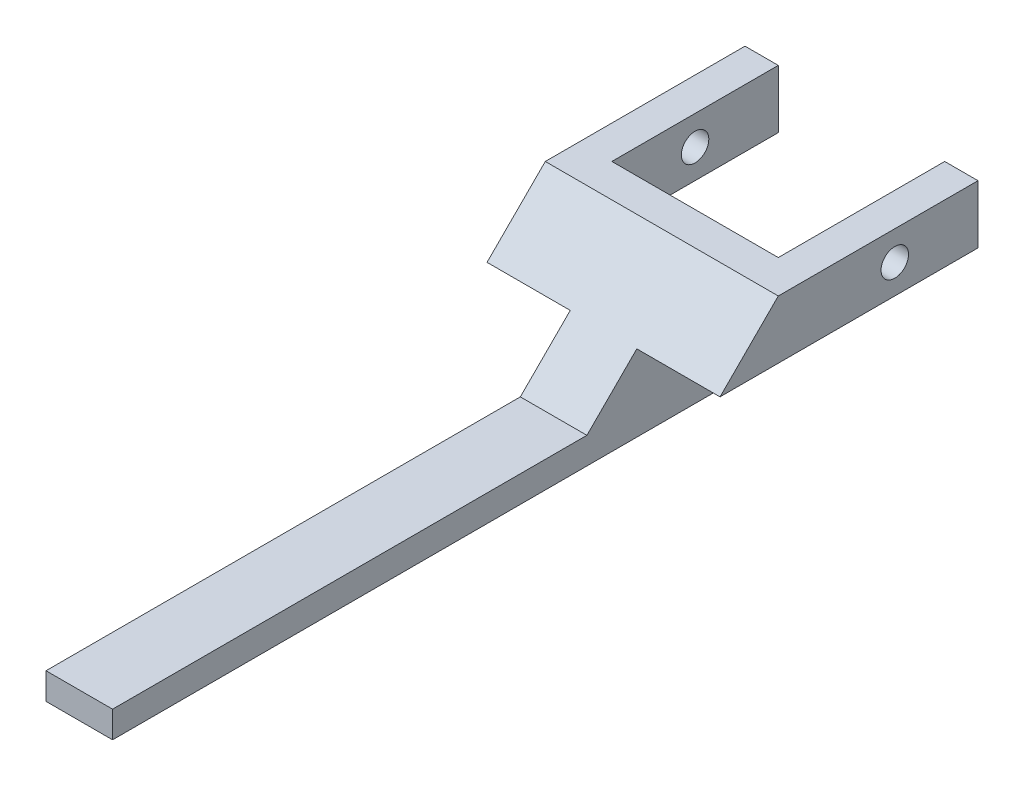
ISO-10303-21;
HEADER;
FILE_DESCRIPTION(('STEP AP214'),'2;1');
FILE_NAME('part.step','',(''),(''),'','','');
FILE_SCHEMA(('AUTOMOTIVE_DESIGN { 1 0 10303 214 1 1 1 1 }'));
ENDSEC;
DATA;
#1=APPLICATION_CONTEXT('core data for automotive mechanical design processes');
#2=APPLICATION_PROTOCOL_DEFINITION('international standard','automotive_design',2000,#1);
#3=PRODUCT_CONTEXT('',#1,'mechanical');
#4=PRODUCT('Part','Part','',(#3));
#5=PRODUCT_RELATED_PRODUCT_CATEGORY('part','',(#4));
#6=PRODUCT_DEFINITION_FORMATION('','',#4);
#7=PRODUCT_DEFINITION_CONTEXT('part definition',#1,'design');
#8=PRODUCT_DEFINITION('design','',#6,#7);
#9=PRODUCT_DEFINITION_SHAPE('','',#8);
#10=(LENGTH_UNIT() NAMED_UNIT(*) SI_UNIT(.MILLI.,.METRE.));
#11=(NAMED_UNIT(*) PLANE_ANGLE_UNIT() SI_UNIT($,.RADIAN.));
#12=(NAMED_UNIT(*) SI_UNIT($,.STERADIAN.) SOLID_ANGLE_UNIT());
#13=UNCERTAINTY_MEASURE_WITH_UNIT(LENGTH_MEASURE(1.E-05),#10,'distance_accuracy_value','');
#14=(GEOMETRIC_REPRESENTATION_CONTEXT(3) GLOBAL_UNCERTAINTY_ASSIGNED_CONTEXT((#13)) GLOBAL_UNIT_ASSIGNED_CONTEXT((#10,
#11,#12)) REPRESENTATION_CONTEXT('',''));
#15=CARTESIAN_POINT('',(0.,0.,0.));
#16=DIRECTION('',(0.,0.,1.));
#17=DIRECTION('',(1.,0.,0.));
#18=AXIS2_PLACEMENT_3D('',#15,#16,#17);
#19=CARTESIAN_POINT('',(0.,0.,24.));
#20=DIRECTION('',(0.,-1.,0.));
#21=DIRECTION('',(1.,0.,0.));
#22=AXIS2_PLACEMENT_3D('',#19,#20,#21);
#23=PLANE('',#22);
#24=DIRECTION('',(1.,0.,0.));
#25=VECTOR('',#24,1.);
#26=CARTESIAN_POINT('',(0.,0.,20.));
#27=LINE('',#26,#25);
#28=CARTESIAN_POINT('',(0.,0.,20.));
#29=VERTEX_POINT('',#28);
#30=CARTESIAN_POINT('',(6.,0.,20.));
#31=VERTEX_POINT('',#30);
#32=EDGE_CURVE('E212',#29,#31,#27,.T.);
#33=ORIENTED_EDGE('',*,*,#32,.T.);
#34=DIRECTION('',(0.,0.,1.));
#35=VECTOR('',#34,1.);
#36=CARTESIAN_POINT('',(6.,0.,8.5487447290817));
#37=LINE('',#36,#35);
#38=CARTESIAN_POINT('',(6.,0.,31.));
#39=VERTEX_POINT('',#38);
#40=EDGE_CURVE('E145',#31,#39,#37,.T.);
#41=ORIENTED_EDGE('',*,*,#40,.T.);
#42=DIRECTION('',(-1.,0.,0.));
#43=VECTOR('',#42,1.);
#44=CARTESIAN_POINT('',(6.,0.,31.));
#45=LINE('',#44,#43);
#46=CARTESIAN_POINT('',(-4.,0.,31.));
#47=VERTEX_POINT('',#46);
#48=EDGE_CURVE('E253',#39,#47,#45,.T.);
#49=ORIENTED_EDGE('',*,*,#48,.T.);
#50=DIRECTION('',(0.,0.,-1.));
#51=VECTOR('',#50,1.);
#52=CARTESIAN_POINT('',(-4.,0.,24.));
#53=LINE('',#52,#51);
#54=CARTESIAN_POINT('',(-4.,0.,0.));
#55=VERTEX_POINT('',#54);
#56=EDGE_CURVE('E241',#47,#55,#53,.T.);
#57=ORIENTED_EDGE('',*,*,#56,.T.);
#58=DIRECTION('',(-1.,0.,0.));
#59=VECTOR('',#58,1.);
#60=CARTESIAN_POINT('',(0.,0.,0.));
#61=LINE('',#60,#59);
#62=CARTESIAN_POINT('',(0.,0.,0.));
#63=VERTEX_POINT('',#62);
#64=EDGE_CURVE('E233',#63,#55,#61,.T.);
#65=ORIENTED_EDGE('',*,*,#64,.F.);
#66=DIRECTION('',(0.,0.,-1.));
#67=VECTOR('',#66,1.);
#68=CARTESIAN_POINT('',(0.,0.,24.));
#69=LINE('',#68,#67);
#70=EDGE_CURVE('E239',#29,#63,#69,.T.);
#71=ORIENTED_EDGE('',*,*,#70,.F.);
#72=EDGE_LOOP('',(#33,#41,#49,#57,#65,#71));
#73=FACE_BOUND('',#72,.T.);
#74=ADVANCED_FACE('F37',(#73),#23,.T.);
#75=CARTESIAN_POINT('',(0.,0.,24.));
#76=DIRECTION('',(-1.,0.,0.));
#77=DIRECTION('',(0.,-1.,0.));
#78=AXIS2_PLACEMENT_3D('',#75,#76,#77);
#79=PLANE('',#78);
#80=CARTESIAN_POINT('',(0.,3.5,10.));
#81=DIRECTION('',(-1.,0.,0.));
#82=DIRECTION('',(0.,-1.,0.));
#83=AXIS2_PLACEMENT_3D('',#80,#81,#82);
#84=CIRCLE('',#83,1.65);
#85=CARTESIAN_POINT('',(0.,1.85,10.));
#86=VERTEX_POINT('',#85);
#87=EDGE_CURVE('E175',#86,#86,#84,.T.);
#88=ORIENTED_EDGE('',*,*,#87,.T.);
#89=EDGE_LOOP('',(#88));
#90=FACE_BOUND('',#89,.T.);
#91=DIRECTION('',(0.,1.,0.));
#92=VECTOR('',#91,1.);
#93=CARTESIAN_POINT('',(0.,0.,20.));
#94=LINE('',#93,#92);
#95=CARTESIAN_POINT('',(0.,7.,20.));
#96=VERTEX_POINT('',#95);
#97=EDGE_CURVE('E219',#29,#96,#94,.T.);
#98=ORIENTED_EDGE('',*,*,#97,.F.);
#99=ORIENTED_EDGE('',*,*,#70,.T.);
#100=DIRECTION('',(0.,1.,0.));
#101=VECTOR('',#100,1.);
#102=CARTESIAN_POINT('',(0.,0.,0.));
#103=LINE('',#102,#101);
#104=CARTESIAN_POINT('',(0.,7.,0.));
#105=VERTEX_POINT('',#104);
#106=EDGE_CURVE('E227',#63,#105,#103,.T.);
#107=ORIENTED_EDGE('',*,*,#106,.T.);
#108=DIRECTION('',(0.,0.,-1.));
#109=VECTOR('',#108,1.);
#110=CARTESIAN_POINT('',(0.,7.,24.));
#111=LINE('',#110,#109);
#112=EDGE_CURVE('E226',#96,#105,#111,.T.);
#113=ORIENTED_EDGE('',*,*,#112,.F.);
#114=EDGE_LOOP('',(#98,#99,#107,#113));
#115=FACE_BOUND('',#114,.T.);
#116=ADVANCED_FACE('F281',(#90,#115),#79,.F.);
#117=CARTESIAN_POINT('',(0.,7.,24.));
#118=DIRECTION('',(0.,-1.,0.));
#119=DIRECTION('',(1.,0.,0.));
#120=AXIS2_PLACEMENT_3D('',#117,#118,#119);
#121=PLANE('',#120);
#122=DIRECTION('',(-1.,0.,0.));
#123=VECTOR('',#122,1.);
#124=CARTESIAN_POINT('',(0.,7.,0.));
#125=LINE('',#124,#123);
#126=CARTESIAN_POINT('',(-4.,7.,0.));
#127=VERTEX_POINT('',#126);
#128=EDGE_CURVE('E222',#105,#127,#125,.T.);
#129=ORIENTED_EDGE('',*,*,#128,.T.);
#130=DIRECTION('',(0.,0.,-1.));
#131=VECTOR('',#130,1.);
#132=CARTESIAN_POINT('',(-4.,7.,24.));
#133=LINE('',#132,#131);
#134=CARTESIAN_POINT('',(-4.,7.,24.));
#135=VERTEX_POINT('',#134);
#136=EDGE_CURVE('E243',#135,#127,#133,.T.);
#137=ORIENTED_EDGE('',*,*,#136,.F.);
#138=DIRECTION('',(-1.,0.,0.));
#139=VECTOR('',#138,1.);
#140=CARTESIAN_POINT('',(0.,7.,24.));
#141=LINE('',#140,#139);
#142=CARTESIAN_POINT('',(24.,7.,24.));
#143=VERTEX_POINT('',#142);
#144=EDGE_CURVE('E223',#143,#135,#141,.T.);
#145=ORIENTED_EDGE('',*,*,#144,.F.);
#146=DIRECTION('',(0.,0.,-1.));
#147=VECTOR('',#146,1.);
#148=CARTESIAN_POINT('',(24.,7.,24.));
#149=LINE('',#148,#147);
#150=CARTESIAN_POINT('',(24.,7.,0.));
#151=VERTEX_POINT('',#150);
#152=EDGE_CURVE('E209',#143,#151,#149,.T.);
#153=ORIENTED_EDGE('',*,*,#152,.T.);
#154=DIRECTION('',(1.,0.,0.));
#155=VECTOR('',#154,1.);
#156=CARTESIAN_POINT('',(0.,7.,0.));
#157=LINE('',#156,#155);
#158=CARTESIAN_POINT('',(20.,7.,0.));
#159=VERTEX_POINT('',#158);
#160=EDGE_CURVE('E196',#159,#151,#157,.T.);
#161=ORIENTED_EDGE('',*,*,#160,.F.);
#162=DIRECTION('',(0.,0.,-1.));
#163=VECTOR('',#162,1.);
#164=CARTESIAN_POINT('',(20.,7.,24.));
#165=LINE('',#164,#163);
#166=CARTESIAN_POINT('',(20.,7.,20.));
#167=VERTEX_POINT('',#166);
#168=EDGE_CURVE('E207',#167,#159,#165,.T.);
#169=ORIENTED_EDGE('',*,*,#168,.F.);
#170=DIRECTION('',(1.,0.,0.));
#171=VECTOR('',#170,1.);
#172=CARTESIAN_POINT('',(0.,7.,20.));
#173=LINE('',#172,#171);
#174=EDGE_CURVE('E217',#96,#167,#173,.T.);
#175=ORIENTED_EDGE('',*,*,#174,.F.);
#176=ORIENTED_EDGE('',*,*,#112,.T.);
#177=EDGE_LOOP('',(#129,#137,#145,#153,#161,#169,#175,#176));
#178=FACE_BOUND('',#177,.T.);
#179=ADVANCED_FACE('F286',(#178),#121,.F.);
#180=CARTESIAN_POINT('',(-4.,0.,24.));
#181=DIRECTION('',(1.,0.,0.));
#182=DIRECTION('',(0.,1.,0.));
#183=AXIS2_PLACEMENT_3D('',#180,#181,#182);
#184=PLANE('',#183);
#185=CARTESIAN_POINT('',(-4.,3.5,10.));
#186=DIRECTION('',(1.,0.,0.));
#187=DIRECTION('',(0.,1.,0.));
#188=AXIS2_PLACEMENT_3D('',#185,#186,#187);
#189=CIRCLE('',#188,1.65);
#190=CARTESIAN_POINT('',(-4.,5.15,10.));
#191=VERTEX_POINT('',#190);
#192=EDGE_CURVE('E171',#191,#191,#189,.F.);
#193=ORIENTED_EDGE('',*,*,#192,.F.);
#194=EDGE_LOOP('',(#193));
#195=FACE_BOUND('',#194,.T.);
#196=DIRECTION('',(0.,-1.,0.));
#197=VECTOR('',#196,1.);
#198=CARTESIAN_POINT('',(-4.,0.,0.));
#199=LINE('',#198,#197);
#200=EDGE_CURVE('E230',#127,#55,#199,.T.);
#201=ORIENTED_EDGE('',*,*,#200,.T.);
#202=ORIENTED_EDGE('',*,*,#56,.F.);
#203=DIRECTION('',(0.,0.707106781186544,-0.707106781186551));
#204=VECTOR('',#203,1.);
#205=CARTESIAN_POINT('',(-4.,3.50000000000001,27.5));
#206=LINE('',#205,#204);
#207=EDGE_CURVE('E256',#47,#135,#206,.T.);
#208=ORIENTED_EDGE('',*,*,#207,.T.);
#209=ORIENTED_EDGE('',*,*,#136,.T.);
#210=EDGE_LOOP('',(#201,#202,#208,#209));
#211=FACE_BOUND('',#210,.T.);
#212=ADVANCED_FACE('F301',(#195,#211),#184,.F.);
#213=DIRECTION('',(0.,0.,1.));
#214=VECTOR('',#213,1.);
#215=CARTESIAN_POINT('',(14.,0.,8.5487447290817));
#216=LINE('',#215,#214);
#217=CARTESIAN_POINT('',(14.,0.,20.));
#218=VERTEX_POINT('',#217);
#219=CARTESIAN_POINT('',(14.,0.,31.));
#220=VERTEX_POINT('',#219);
#221=EDGE_CURVE('E52',#218,#220,#216,.T.);
#222=ORIENTED_EDGE('',*,*,#221,.F.);
#223=CARTESIAN_POINT('',(20.,0.,20.));
#224=VERTEX_POINT('',#223);
#225=EDGE_CURVE('E211',#218,#224,#27,.T.);
#226=ORIENTED_EDGE('',*,*,#225,.T.);
#227=DIRECTION('',(0.,0.,-1.));
#228=VECTOR('',#227,1.);
#229=CARTESIAN_POINT('',(20.,0.,24.));
#230=LINE('',#229,#228);
#231=CARTESIAN_POINT('',(20.,0.,0.));
#232=VERTEX_POINT('',#231);
#233=EDGE_CURVE('E205',#224,#232,#230,.T.);
#234=ORIENTED_EDGE('',*,*,#233,.T.);
#235=DIRECTION('',(1.,0.,0.));
#236=VECTOR('',#235,1.);
#237=CARTESIAN_POINT('',(0.,0.,0.));
#238=LINE('',#237,#236);
#239=CARTESIAN_POINT('',(24.,0.,0.));
#240=VERTEX_POINT('',#239);
#241=EDGE_CURVE('E202',#232,#240,#238,.T.);
#242=ORIENTED_EDGE('',*,*,#241,.T.);
#243=DIRECTION('',(0.,0.,-1.));
#244=VECTOR('',#243,1.);
#245=CARTESIAN_POINT('',(24.,0.,24.));
#246=LINE('',#245,#244);
#247=CARTESIAN_POINT('',(24.,0.,31.));
#248=VERTEX_POINT('',#247);
#249=EDGE_CURVE('E59',#248,#240,#246,.T.);
#250=ORIENTED_EDGE('',*,*,#249,.F.);
#251=DIRECTION('',(-1.,0.,0.));
#252=VECTOR('',#251,1.);
#253=CARTESIAN_POINT('',(6.,0.,31.));
#254=LINE('',#253,#252);
#255=EDGE_CURVE('E46',#248,#220,#254,.T.);
#256=ORIENTED_EDGE('',*,*,#255,.T.);
#257=EDGE_LOOP('',(#222,#226,#234,#242,#250,#256));
#258=FACE_BOUND('',#257,.T.);
#259=ADVANCED_FACE('F261',(#258),#23,.T.);
#260=CARTESIAN_POINT('',(0.,0.,0.));
#261=DIRECTION('',(0.,0.,1.));
#262=DIRECTION('',(1.,0.,0.));
#263=AXIS2_PLACEMENT_3D('',#260,#261,#262);
#264=PLANE('',#263);
#265=ORIENTED_EDGE('',*,*,#128,.F.);
#266=ORIENTED_EDGE('',*,*,#106,.F.);
#267=ORIENTED_EDGE('',*,*,#64,.T.);
#268=ORIENTED_EDGE('',*,*,#200,.F.);
#269=EDGE_LOOP('',(#265,#266,#267,#268));
#270=FACE_BOUND('',#269,.T.);
#271=ADVANCED_FACE('F303',(#270),#264,.F.);
#272=CARTESIAN_POINT('',(0.,0.,20.));
#273=DIRECTION('',(0.,0.,1.));
#274=DIRECTION('',(1.,0.,0.));
#275=AXIS2_PLACEMENT_3D('',#272,#273,#274);
#276=PLANE('',#275);
#277=ORIENTED_EDGE('',*,*,#32,.F.);
#278=ORIENTED_EDGE('',*,*,#97,.T.);
#279=ORIENTED_EDGE('',*,*,#174,.T.);
#280=DIRECTION('',(0.,1.,0.));
#281=VECTOR('',#280,1.);
#282=CARTESIAN_POINT('',(20.,0.,20.));
#283=LINE('',#282,#281);
#284=EDGE_CURVE('E214',#224,#167,#283,.T.);
#285=ORIENTED_EDGE('',*,*,#284,.F.);
#286=ORIENTED_EDGE('',*,*,#225,.F.);
#287=DIRECTION('',(0.,1.,0.));
#288=VECTOR('',#287,1.);
#289=CARTESIAN_POINT('',(14.,-8.1933660530782,20.));
#290=LINE('',#289,#288);
#291=CARTESIAN_POINT('',(14.,-9.1933660530782,20.));
#292=VERTEX_POINT('',#291);
#293=EDGE_CURVE('E149',#292,#218,#290,.T.);
#294=ORIENTED_EDGE('',*,*,#293,.F.);
#295=DIRECTION('',(1.,0.,0.));
#296=VECTOR('',#295,1.);
#297=CARTESIAN_POINT('',(6.,-9.1933660530782,20.));
#298=LINE('',#297,#296);
#299=CARTESIAN_POINT('',(6.,-9.1933660530782,20.));
#300=VERTEX_POINT('',#299);
#301=EDGE_CURVE('E152',#300,#292,#298,.T.);
#302=ORIENTED_EDGE('',*,*,#301,.F.);
#303=DIRECTION('',(0.,-1.,0.));
#304=VECTOR('',#303,1.);
#305=CARTESIAN_POINT('',(6.,-8.1933660530782,20.));
#306=LINE('',#305,#304);
#307=EDGE_CURVE('E138',#31,#300,#306,.T.);
#308=ORIENTED_EDGE('',*,*,#307,.F.);
#309=EDGE_LOOP('',(#277,#278,#279,#285,#286,#294,#302,#308));
#310=FACE_BOUND('',#309,.T.);
#311=ADVANCED_FACE('F153',(#310),#276,.F.);
#312=CARTESIAN_POINT('',(24.,0.,24.));
#313=DIRECTION('',(1.,0.,0.));
#314=DIRECTION('',(0.,0.,-1.));
#315=AXIS2_PLACEMENT_3D('',#312,#313,#314);
#316=PLANE('',#315);
#317=CARTESIAN_POINT('',(24.,3.5,10.));
#318=DIRECTION('',(1.,0.,0.));
#319=DIRECTION('',(0.,0.,-1.));
#320=AXIS2_PLACEMENT_3D('',#317,#318,#319);
#321=CIRCLE('',#320,1.65);
#322=CARTESIAN_POINT('',(24.,3.5,8.35));
#323=VERTEX_POINT('',#322);
#324=EDGE_CURVE('E168',#323,#323,#321,.T.);
#325=ORIENTED_EDGE('',*,*,#324,.F.);
#326=EDGE_LOOP('',(#325));
#327=FACE_BOUND('',#326,.T.);
#328=DIRECTION('',(0.,-1.,0.));
#329=VECTOR('',#328,1.);
#330=CARTESIAN_POINT('',(24.,0.,0.));
#331=LINE('',#330,#329);
#332=EDGE_CURVE('E191',#151,#240,#331,.T.);
#333=ORIENTED_EDGE('',*,*,#332,.F.);
#334=ORIENTED_EDGE('',*,*,#152,.F.);
#335=DIRECTION('',(0.,-0.707106781186544,0.707106781186551));
#336=VECTOR('',#335,1.);
#337=CARTESIAN_POINT('',(24.,-6.,37.0000000000001));
#338=LINE('',#337,#336);
#339=EDGE_CURVE('E258',#143,#248,#338,.T.);
#340=ORIENTED_EDGE('',*,*,#339,.T.);
#341=ORIENTED_EDGE('',*,*,#249,.T.);
#342=EDGE_LOOP('',(#333,#334,#340,#341));
#343=FACE_BOUND('',#342,.T.);
#344=ADVANCED_FACE('F298',(#327,#343),#316,.T.);
#345=CARTESIAN_POINT('',(20.,0.,24.));
#346=DIRECTION('',(-1.,0.,0.));
#347=DIRECTION('',(0.,0.,1.));
#348=AXIS2_PLACEMENT_3D('',#345,#346,#347);
#349=PLANE('',#348);
#350=CARTESIAN_POINT('',(20.,3.5,10.));
#351=DIRECTION('',(-1.,0.,0.));
#352=DIRECTION('',(0.,0.,1.));
#353=AXIS2_PLACEMENT_3D('',#350,#351,#352);
#354=CIRCLE('',#353,1.65);
#355=CARTESIAN_POINT('',(20.,3.5,11.65));
#356=VERTEX_POINT('',#355);
#357=EDGE_CURVE('E174',#356,#356,#354,.T.);
#358=ORIENTED_EDGE('',*,*,#357,.F.);
#359=EDGE_LOOP('',(#358));
#360=FACE_BOUND('',#359,.T.);
#361=ORIENTED_EDGE('',*,*,#233,.F.);
#362=ORIENTED_EDGE('',*,*,#284,.T.);
#363=ORIENTED_EDGE('',*,*,#168,.T.);
#364=DIRECTION('',(0.,1.,0.));
#365=VECTOR('',#364,1.);
#366=CARTESIAN_POINT('',(20.,0.,0.));
#367=LINE('',#366,#365);
#368=EDGE_CURVE('E199',#232,#159,#367,.T.);
#369=ORIENTED_EDGE('',*,*,#368,.F.);
#370=EDGE_LOOP('',(#361,#362,#363,#369));
#371=FACE_BOUND('',#370,.T.);
#372=ADVANCED_FACE('F291',(#360,#371),#349,.T.);
#373=CARTESIAN_POINT('',(0.,0.,0.));
#374=DIRECTION('',(0.,0.,1.));
#375=DIRECTION('',(1.,0.,0.));
#376=AXIS2_PLACEMENT_3D('',#373,#374,#375);
#377=PLANE('',#376);
#378=ORIENTED_EDGE('',*,*,#332,.T.);
#379=ORIENTED_EDGE('',*,*,#241,.F.);
#380=ORIENTED_EDGE('',*,*,#368,.T.);
#381=ORIENTED_EDGE('',*,*,#160,.T.);
#382=EDGE_LOOP('',(#378,#379,#380,#381));
#383=FACE_BOUND('',#382,.T.);
#384=ADVANCED_FACE('F294',(#383),#377,.F.);
#385=CARTESIAN_POINT('',(6.,-8.1933660530782,8.5487447290817));
#386=DIRECTION('',(1.,0.,0.));
#387=DIRECTION('',(0.,0.,-1.));
#388=AXIS2_PLACEMENT_3D('',#385,#386,#387);
#389=PLANE('',#388);
#390=ORIENTED_EDGE('',*,*,#40,.F.);
#391=ORIENTED_EDGE('',*,*,#307,.T.);
#392=DIRECTION('',(0.,0.,-1.));
#393=VECTOR('',#392,1.);
#394=CARTESIAN_POINT('',(6.,-9.1933660530782,94.));
#395=LINE('',#394,#393);
#396=CARTESIAN_POINT('',(6.,-9.1933660530782,94.));
#397=VERTEX_POINT('',#396);
#398=EDGE_CURVE('E143',#397,#300,#395,.T.);
#399=ORIENTED_EDGE('',*,*,#398,.F.);
#400=DIRECTION('',(0.,-1.,0.));
#401=VECTOR('',#400,1.);
#402=CARTESIAN_POINT('',(6.,-6.,94.));
#403=LINE('',#402,#401);
#404=CARTESIAN_POINT('',(6.,-6.,94.));
#405=VERTEX_POINT('',#404);
#406=EDGE_CURVE('E178',#405,#397,#403,.T.);
#407=ORIENTED_EDGE('',*,*,#406,.F.);
#408=DIRECTION('',(0.,0.,-1.));
#409=VECTOR('',#408,1.);
#410=CARTESIAN_POINT('',(6.,-6.,94.));
#411=LINE('',#410,#409);
#412=CARTESIAN_POINT('',(6.,-6.,37.0000000000001));
#413=VERTEX_POINT('',#412);
#414=EDGE_CURVE('E184',#405,#413,#411,.T.);
#415=ORIENTED_EDGE('',*,*,#414,.T.);
#416=DIRECTION('',(0.,0.707106781186544,-0.707106781186551));
#417=VECTOR('',#416,1.);
#418=CARTESIAN_POINT('',(6.,7.1289446089201,23.8710553910798));
#419=LINE('',#418,#417);
#420=EDGE_CURVE('E251',#413,#39,#419,.T.);
#421=ORIENTED_EDGE('',*,*,#420,.T.);
#422=EDGE_LOOP('',(#390,#391,#399,#407,#415,#421));
#423=FACE_BOUND('',#422,.T.);
#424=ADVANCED_FACE('F140',(#423),#389,.F.);
#425=CARTESIAN_POINT('',(14.,-8.1933660530782,8.5487447290817));
#426=DIRECTION('',(-1.,0.,0.));
#427=DIRECTION('',(0.,0.,1.));
#428=AXIS2_PLACEMENT_3D('',#425,#426,#427);
#429=PLANE('',#428);
#430=DIRECTION('',(0.,1.,0.));
#431=VECTOR('',#430,1.);
#432=CARTESIAN_POINT('',(14.,-6.,94.));
#433=LINE('',#432,#431);
#434=CARTESIAN_POINT('',(14.,-9.1933660530782,94.));
#435=VERTEX_POINT('',#434);
#436=CARTESIAN_POINT('',(14.,-6.,94.));
#437=VERTEX_POINT('',#436);
#438=EDGE_CURVE('E180',#435,#437,#433,.T.);
#439=ORIENTED_EDGE('',*,*,#438,.F.);
#440=DIRECTION('',(0.,0.,1.));
#441=VECTOR('',#440,1.);
#442=CARTESIAN_POINT('',(14.,-9.1933660530782,94.));
#443=LINE('',#442,#441);
#444=EDGE_CURVE('E158',#292,#435,#443,.T.);
#445=ORIENTED_EDGE('',*,*,#444,.F.);
#446=ORIENTED_EDGE('',*,*,#293,.T.);
#447=ORIENTED_EDGE('',*,*,#221,.T.);
#448=DIRECTION('',(0.,-0.707106781186544,0.707106781186551));
#449=VECTOR('',#448,1.);
#450=CARTESIAN_POINT('',(14.,7.1289446089201,23.8710553910798));
#451=LINE('',#450,#449);
#452=CARTESIAN_POINT('',(14.,-6.,37.0000000000001));
#453=VERTEX_POINT('',#452);
#454=EDGE_CURVE('E11',#220,#453,#451,.T.);
#455=ORIENTED_EDGE('',*,*,#454,.T.);
#456=DIRECTION('',(0.,0.,-1.));
#457=VECTOR('',#456,1.);
#458=CARTESIAN_POINT('',(14.,-6.,94.));
#459=LINE('',#458,#457);
#460=EDGE_CURVE('E187',#437,#453,#459,.T.);
#461=ORIENTED_EDGE('',*,*,#460,.F.);
#462=EDGE_LOOP('',(#439,#445,#446,#447,#455,#461));
#463=FACE_BOUND('',#462,.T.);
#464=ADVANCED_FACE('F266',(#463),#429,.F.);
#465=CARTESIAN_POINT('',(6.,-6.,94.));
#466=DIRECTION('',(0.,-1.,0.));
#467=DIRECTION('',(0.,0.,-1.));
#468=AXIS2_PLACEMENT_3D('',#465,#466,#467);
#469=PLANE('',#468);
#470=ORIENTED_EDGE('',*,*,#460,.T.);
#471=DIRECTION('',(-1.,0.,0.));
#472=VECTOR('',#471,1.);
#473=CARTESIAN_POINT('',(6.,-6.,37.0000000000001));
#474=LINE('',#473,#472);
#475=EDGE_CURVE('E246',#453,#413,#474,.T.);
#476=ORIENTED_EDGE('',*,*,#475,.T.);
#477=ORIENTED_EDGE('',*,*,#414,.F.);
#478=DIRECTION('',(-1.,0.,0.));
#479=VECTOR('',#478,1.);
#480=CARTESIAN_POINT('',(6.,-6.,94.));
#481=LINE('',#480,#479);
#482=EDGE_CURVE('E182',#437,#405,#481,.T.);
#483=ORIENTED_EDGE('',*,*,#482,.F.);
#484=EDGE_LOOP('',(#470,#476,#477,#483));
#485=FACE_BOUND('',#484,.T.);
#486=ADVANCED_FACE('F269',(#485),#469,.F.);
#487=CARTESIAN_POINT('',(0.,0.,94.));
#488=DIRECTION('',(0.,0.,1.));
#489=DIRECTION('',(1.,0.,0.));
#490=AXIS2_PLACEMENT_3D('',#487,#488,#489);
#491=PLANE('',#490);
#492=ORIENTED_EDGE('',*,*,#406,.T.);
#493=DIRECTION('',(-1.,0.,0.));
#494=VECTOR('',#493,1.);
#495=CARTESIAN_POINT('',(6.,-9.1933660530782,94.));
#496=LINE('',#495,#494);
#497=EDGE_CURVE('E163',#435,#397,#496,.T.);
#498=ORIENTED_EDGE('',*,*,#497,.F.);
#499=ORIENTED_EDGE('',*,*,#438,.T.);
#500=ORIENTED_EDGE('',*,*,#482,.T.);
#501=EDGE_LOOP('',(#492,#498,#499,#500));
#502=FACE_BOUND('',#501,.T.);
#503=ADVANCED_FACE('F272',(#502),#491,.T.);
#504=CARTESIAN_POINT('',(-8.66690475583121,3.5,10.));
#505=DIRECTION('',(1.,0.,0.));
#506=DIRECTION('',(0.,0.,-1.));
#507=AXIS2_PLACEMENT_3D('',#504,#505,#506);
#508=CYLINDRICAL_SURFACE('',#507,1.65);
#509=ORIENTED_EDGE('',*,*,#357,.T.);
#510=EDGE_LOOP('',(#509));
#511=FACE_BOUND('',#510,.T.);
#512=ORIENTED_EDGE('',*,*,#324,.T.);
#513=EDGE_LOOP('',(#512));
#514=FACE_BOUND('',#513,.T.);
#515=ADVANCED_FACE('F404',(#511,#514),#508,.F.);
#516=ORIENTED_EDGE('',*,*,#192,.T.);
#517=EDGE_LOOP('',(#516));
#518=FACE_BOUND('',#517,.T.);
#519=ORIENTED_EDGE('',*,*,#87,.F.);
#520=EDGE_LOOP('',(#519));
#521=FACE_BOUND('',#520,.T.);
#522=ADVANCED_FACE('F369',(#518,#521),#508,.F.);
#523=CARTESIAN_POINT('',(6.,-6.,37.0000000000001));
#524=DIRECTION('',(0.,-0.707106781186551,-0.707106781186544));
#525=DIRECTION('',(-1.,0.,0.));
#526=AXIS2_PLACEMENT_3D('',#523,#524,#525);
#527=PLANE('',#526);
#528=ORIENTED_EDGE('',*,*,#339,.F.);
#529=ORIENTED_EDGE('',*,*,#144,.T.);
#530=ORIENTED_EDGE('',*,*,#207,.F.);
#531=ORIENTED_EDGE('',*,*,#48,.F.);
#532=ORIENTED_EDGE('',*,*,#420,.F.);
#533=ORIENTED_EDGE('',*,*,#475,.F.);
#534=ORIENTED_EDGE('',*,*,#454,.F.);
#535=ORIENTED_EDGE('',*,*,#255,.F.);
#536=EDGE_LOOP('',(#528,#529,#530,#531,#532,#533,#534,#535));
#537=FACE_BOUND('',#536,.T.);
#538=ADVANCED_FACE('F40',(#537),#527,.F.);
#539=CARTESIAN_POINT('',(0.,-9.1933660530782,0.));
#540=DIRECTION('',(0.,-1.,0.));
#541=DIRECTION('',(0.,0.,-1.));
#542=AXIS2_PLACEMENT_3D('',#539,#540,#541);
#543=PLANE('',#542);
#544=ORIENTED_EDGE('',*,*,#398,.T.);
#545=ORIENTED_EDGE('',*,*,#301,.T.);
#546=ORIENTED_EDGE('',*,*,#444,.T.);
#547=ORIENTED_EDGE('',*,*,#497,.T.);
#548=EDGE_LOOP('',(#544,#545,#546,#547));
#549=FACE_BOUND('',#548,.T.);
#550=ADVANCED_FACE('F161',(#549),#543,.T.);
#551=CLOSED_SHELL('',(#74,#116,#179,#212,#259,#271,#311,#344,#372,#384,#424,#464,#486,#503,#515,
#522,#538,#550));
#552=MANIFOLD_SOLID_BREP('B2',#551);
#553=ADVANCED_BREP_SHAPE_REPRESENTATION('',(#18,#552),#14);
#554=SHAPE_DEFINITION_REPRESENTATION(#9,#553);
ENDSEC;
END-ISO-10303-21;
